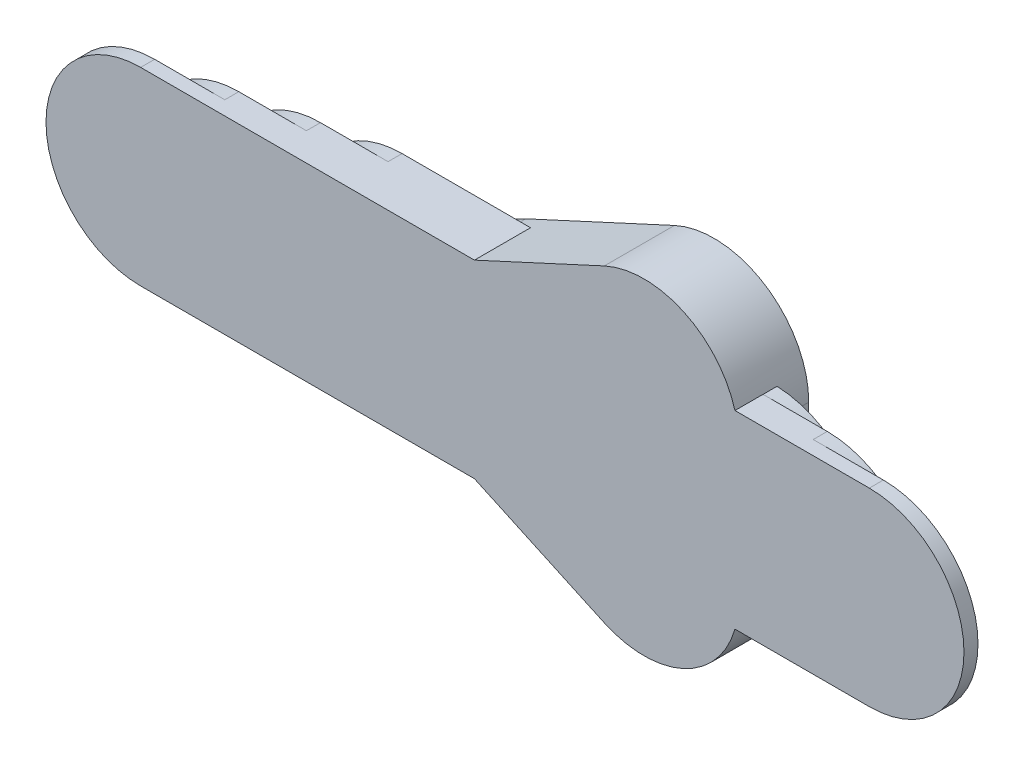
ISO-10303-21;
HEADER;
FILE_DESCRIPTION(('STEP AP214'),'2;1');
FILE_NAME('part.step','',(''),(''),'','','');
FILE_SCHEMA(('AUTOMOTIVE_DESIGN { 1 0 10303 214 1 1 1 1 }'));
ENDSEC;
DATA;
#1=APPLICATION_CONTEXT('core data for automotive mechanical design processes');
#2=APPLICATION_PROTOCOL_DEFINITION('international standard','automotive_design',2000,#1);
#3=PRODUCT_CONTEXT('',#1,'mechanical');
#4=PRODUCT('Part','Part','',(#3));
#5=PRODUCT_RELATED_PRODUCT_CATEGORY('part','',(#4));
#6=PRODUCT_DEFINITION_FORMATION('','',#4);
#7=PRODUCT_DEFINITION_CONTEXT('part definition',#1,'design');
#8=PRODUCT_DEFINITION('design','',#6,#7);
#9=PRODUCT_DEFINITION_SHAPE('','',#8);
#10=(LENGTH_UNIT() NAMED_UNIT(*) SI_UNIT(.MILLI.,.METRE.));
#11=(NAMED_UNIT(*) PLANE_ANGLE_UNIT() SI_UNIT($,.RADIAN.));
#12=(NAMED_UNIT(*) SI_UNIT($,.STERADIAN.) SOLID_ANGLE_UNIT());
#13=UNCERTAINTY_MEASURE_WITH_UNIT(LENGTH_MEASURE(1.E-05),#10,'distance_accuracy_value','');
#14=(GEOMETRIC_REPRESENTATION_CONTEXT(3) GLOBAL_UNCERTAINTY_ASSIGNED_CONTEXT((#13)) GLOBAL_UNIT_ASSIGNED_CONTEXT((#10,
#11,#12)) REPRESENTATION_CONTEXT('',''));
#15=CARTESIAN_POINT('',(0.,0.,0.));
#16=DIRECTION('',(0.,0.,1.));
#17=DIRECTION('',(1.,0.,0.));
#18=AXIS2_PLACEMENT_3D('',#15,#16,#17);
#19=CARTESIAN_POINT('',(-1.94999999999999,0.,-2.8));
#20=DIRECTION('',(0.,0.,1.));
#21=DIRECTION('',(1.,0.,0.));
#22=AXIS2_PLACEMENT_3D('',#19,#20,#21);
#23=CYLINDRICAL_SURFACE('',#22,18.9);
#24=CARTESIAN_POINT('',(-1.94999999999999,0.,0.));
#25=DIRECTION('',(0.,0.,-1.));
#26=DIRECTION('',(-1.,0.,0.));
#27=AXIS2_PLACEMENT_3D('',#24,#25,#26);
#28=CIRCLE('',#27,18.9);
#29=CARTESIAN_POINT('',(-9.86653496346351,-17.1621232419611,0.));
#30=VERTEX_POINT('',#29);
#31=CARTESIAN_POINT('',(-18.0097633136095,-9.96463759054204,0.));
#32=VERTEX_POINT('',#31);
#33=EDGE_CURVE('E232',#30,#32,#28,.T.);
#34=ORIENTED_EDGE('',*,*,#33,.T.);
#35=DIRECTION('',(0.,0.,-1.));
#36=VECTOR('',#35,1.);
#37=CARTESIAN_POINT('',(-18.0097633136095,-9.96463759054204,22.7488622004919));
#38=LINE('',#37,#36);
#39=CARTESIAN_POINT('',(-18.0097633136095,-9.96463759054204,-2.8));
#40=VERTEX_POINT('',#39);
#41=EDGE_CURVE('E221',#32,#40,#38,.T.);
#42=ORIENTED_EDGE('',*,*,#41,.T.);
#43=CARTESIAN_POINT('',(-1.94999999999999,0.,-2.8));
#44=DIRECTION('',(0.,0.,-1.));
#45=DIRECTION('',(-1.,0.,0.));
#46=AXIS2_PLACEMENT_3D('',#43,#44,#45);
#47=CIRCLE('',#46,18.9);
#48=CARTESIAN_POINT('',(-9.86653496346351,-17.1621232419611,-2.8));
#49=VERTEX_POINT('',#48);
#50=EDGE_CURVE('E231',#49,#40,#47,.T.);
#51=ORIENTED_EDGE('',*,*,#50,.F.);
#52=DIRECTION('',(0.,0.,1.));
#53=VECTOR('',#52,1.);
#54=CARTESIAN_POINT('',(-9.86653496346351,-17.1621232419611,-2.8));
#55=LINE('',#54,#53);
#56=EDGE_CURVE('E254',#49,#30,#55,.T.);
#57=ORIENTED_EDGE('',*,*,#56,.T.);
#58=EDGE_LOOP('',(#34,#42,#51,#57));
#59=FACE_BOUND('',#58,.T.);
#60=ADVANCED_FACE('F33',(#59),#23,.T.);
#61=CARTESIAN_POINT('',(31.75,0.,2.8));
#62=DIRECTION('',(0.,0.,-1.));
#63=DIRECTION('',(-1.,0.,0.));
#64=AXIS2_PLACEMENT_3D('',#61,#62,#63);
#65=CYLINDRICAL_SURFACE('',#64,18.9);
#66=DIRECTION('',(0.,0.,-1.));
#67=VECTOR('',#66,1.);
#68=CARTESIAN_POINT('',(46.65,11.6275534829989,67.9653304542279));
#69=LINE('',#68,#67);
#70=CARTESIAN_POINT('',(46.65,11.6275534829989,2.8));
#71=VERTEX_POINT('',#70);
#72=CARTESIAN_POINT('',(46.65,11.6275534829989,0.));
#73=VERTEX_POINT('',#72);
#74=EDGE_CURVE('E474',#71,#73,#69,.T.);
#75=ORIENTED_EDGE('',*,*,#74,.F.);
#76=CARTESIAN_POINT('',(31.75,0.,2.8));
#77=DIRECTION('',(0.,0.,1.));
#78=DIRECTION('',(-1.,0.,0.));
#79=AXIS2_PLACEMENT_3D('',#76,#77,#78);
#80=CIRCLE('',#79,18.9);
#81=CARTESIAN_POINT('',(46.65,-11.6275534829989,2.8));
#82=VERTEX_POINT('',#81);
#83=EDGE_CURVE('E273',#82,#71,#80,.T.);
#84=ORIENTED_EDGE('',*,*,#83,.F.);
#85=DIRECTION('',(0.,0.,-1.));
#86=VECTOR('',#85,1.);
#87=CARTESIAN_POINT('',(46.65,-11.6275534829989,67.9653304542279));
#88=LINE('',#87,#86);
#89=CARTESIAN_POINT('',(46.65,-11.6275534829989,0.));
#90=VERTEX_POINT('',#89);
#91=EDGE_CURVE('E313',#82,#90,#88,.T.);
#92=ORIENTED_EDGE('',*,*,#91,.T.);
#93=CARTESIAN_POINT('',(31.75,0.,0.));
#94=DIRECTION('',(0.,0.,1.));
#95=DIRECTION('',(-1.,0.,0.));
#96=AXIS2_PLACEMENT_3D('',#93,#94,#95);
#97=CIRCLE('',#96,18.9);
#98=EDGE_CURVE('E272',#90,#73,#97,.T.);
#99=ORIENTED_EDGE('',*,*,#98,.T.);
#100=EDGE_LOOP('',(#75,#84,#92,#99));
#101=FACE_BOUND('',#100,.T.);
#102=ADVANCED_FACE('F35',(#101),#65,.T.);
#103=CARTESIAN_POINT('',(45.25,0.,2.8));
#104=DIRECTION('',(0.,0.,-1.));
#105=DIRECTION('',(-1.,0.,0.));
#106=AXIS2_PLACEMENT_3D('',#103,#104,#105);
#107=PLANE('',#106);
#108=DIRECTION('',(0.,1.,0.));
#109=VECTOR('',#108,1.);
#110=CARTESIAN_POINT('',(46.6500000000002,0.,2.8));
#111=LINE('',#110,#109);
#112=CARTESIAN_POINT('',(46.65,13.7,2.8));
#113=VERTEX_POINT('',#112);
#114=EDGE_CURVE('E536',#71,#113,#111,.T.);
#115=ORIENTED_EDGE('',*,*,#114,.T.);
#116=CARTESIAN_POINT('',(27.75,13.7,2.8));
#117=DIRECTION('',(0.,0.,-1.));
#118=DIRECTION('',(-1.,0.,0.));
#119=AXIS2_PLACEMENT_3D('',#116,#117,#118);
#120=CIRCLE('',#119,18.9);
#121=CARTESIAN_POINT('',(45.9240168223525,18.8879776927861,2.8));
#122=VERTEX_POINT('',#121);
#123=EDGE_CURVE('E422',#113,#122,#120,.F.);
#124=ORIENTED_EDGE('',*,*,#123,.T.);
#125=CARTESIAN_POINT('',(45.25,0.,2.8));
#126=DIRECTION('',(0.,0.,1.));
#127=DIRECTION('',(-1.,0.,0.));
#128=AXIS2_PLACEMENT_3D('',#125,#126,#127);
#129=CIRCLE('',#128,18.9);
#130=CARTESIAN_POINT('',(45.9240168223526,-18.8879776927861,2.8));
#131=VERTEX_POINT('',#130);
#132=EDGE_CURVE('E386',#131,#122,#129,.T.);
#133=ORIENTED_EDGE('',*,*,#132,.F.);
#134=CARTESIAN_POINT('',(27.75,-13.7,2.8));
#135=DIRECTION('',(0.,0.,-1.));
#136=DIRECTION('',(-1.,0.,0.));
#137=AXIS2_PLACEMENT_3D('',#134,#135,#136);
#138=CIRCLE('',#137,18.9);
#139=CARTESIAN_POINT('',(46.65,-13.7,2.8));
#140=VERTEX_POINT('',#139);
#141=EDGE_CURVE('E486',#131,#140,#138,.F.);
#142=ORIENTED_EDGE('',*,*,#141,.T.);
#143=DIRECTION('',(0.,1.,0.));
#144=VECTOR('',#143,1.);
#145=CARTESIAN_POINT('',(46.6500000000001,0.,2.8));
#146=LINE('',#145,#144);
#147=EDGE_CURVE('E337',#140,#82,#146,.T.);
#148=ORIENTED_EDGE('',*,*,#147,.T.);
#149=ORIENTED_EDGE('',*,*,#83,.T.);
#150=EDGE_LOOP('',(#115,#124,#133,#142,#148,#149));
#151=FACE_BOUND('',#150,.T.);
#152=ADVANCED_FACE('F449',(#151),#107,.T.);
#153=CARTESIAN_POINT('',(45.25,0.,5.6));
#154=DIRECTION('',(0.,0.,-1.));
#155=DIRECTION('',(-1.,0.,0.));
#156=AXIS2_PLACEMENT_3D('',#153,#154,#155);
#157=CYLINDRICAL_SURFACE('',#156,18.9);
#158=DIRECTION('',(0.,0.,-1.));
#159=VECTOR('',#158,1.);
#160=CARTESIAN_POINT('',(45.9240168223525,18.8879776927861,5.6));
#161=LINE('',#160,#159);
#162=CARTESIAN_POINT('',(45.9240168223525,18.8879776927861,5.6));
#163=VERTEX_POINT('',#162);
#164=EDGE_CURVE('E476',#163,#122,#161,.T.);
#165=ORIENTED_EDGE('',*,*,#164,.F.);
#166=CARTESIAN_POINT('',(45.25,0.,5.6));
#167=DIRECTION('',(0.,0.,1.));
#168=DIRECTION('',(-1.,0.,0.));
#169=AXIS2_PLACEMENT_3D('',#166,#167,#168);
#170=CIRCLE('',#169,18.9);
#171=CARTESIAN_POINT('',(45.9240168223526,-18.8879776927861,5.6));
#172=VERTEX_POINT('',#171);
#173=EDGE_CURVE('E387',#172,#163,#170,.T.);
#174=ORIENTED_EDGE('',*,*,#173,.F.);
#175=DIRECTION('',(0.,0.,-1.));
#176=VECTOR('',#175,1.);
#177=CARTESIAN_POINT('',(45.9240168223526,-18.8879776927861,4.2));
#178=LINE('',#177,#176);
#179=EDGE_CURVE('E484',#131,#172,#178,.F.);
#180=ORIENTED_EDGE('',*,*,#179,.F.);
#181=ORIENTED_EDGE('',*,*,#132,.T.);
#182=EDGE_LOOP('',(#165,#174,#180,#181));
#183=FACE_BOUND('',#182,.T.);
#184=ADVANCED_FACE('F529',(#183),#157,.T.);
#185=CARTESIAN_POINT('',(-31.75,18.9,2.8));
#186=DIRECTION('',(0.,-1.,0.));
#187=DIRECTION('',(0.,0.,-1.));
#188=AXIS2_PLACEMENT_3D('',#185,#186,#187);
#189=PLANE('',#188);
#190=DIRECTION('',(0.,0.,-1.));
#191=VECTOR('',#190,1.);
#192=CARTESIAN_POINT('',(-6.09902111574405,18.9,67.9653304542279));
#193=LINE('',#192,#191);
#194=CARTESIAN_POINT('',(-6.09902111574405,18.9,11.2));
#195=VERTEX_POINT('',#194);
#196=CARTESIAN_POINT('',(-6.09902111574405,18.9,0.));
#197=VERTEX_POINT('',#196);
#198=EDGE_CURVE('E58',#195,#197,#193,.T.);
#199=ORIENTED_EDGE('',*,*,#198,.T.);
#200=DIRECTION('',(-1.,0.,0.));
#201=VECTOR('',#200,1.);
#202=CARTESIAN_POINT('',(-31.75,18.9,0.));
#203=LINE('',#202,#201);
#204=CARTESIAN_POINT('',(-31.75,18.9,0.));
#205=VERTEX_POINT('',#204);
#206=EDGE_CURVE('E283',#197,#205,#203,.T.);
#207=ORIENTED_EDGE('',*,*,#206,.T.);
#208=DIRECTION('',(0.,0.,-1.));
#209=VECTOR('',#208,1.);
#210=CARTESIAN_POINT('',(-31.75,18.9,2.8));
#211=LINE('',#210,#209);
#212=CARTESIAN_POINT('',(-31.75,18.9,2.8));
#213=VERTEX_POINT('',#212);
#214=EDGE_CURVE('E37',#213,#205,#211,.T.);
#215=ORIENTED_EDGE('',*,*,#214,.F.);
#216=DIRECTION('',(-1.,0.,0.));
#217=VECTOR('',#216,1.);
#218=CARTESIAN_POINT('',(-45.25,18.9,2.8));
#219=LINE('',#218,#217);
#220=CARTESIAN_POINT('',(-45.25,18.9,2.8));
#221=VERTEX_POINT('',#220);
#222=EDGE_CURVE('E397',#213,#221,#219,.T.);
#223=ORIENTED_EDGE('',*,*,#222,.T.);
#224=DIRECTION('',(0.,0.,-1.));
#225=VECTOR('',#224,1.);
#226=CARTESIAN_POINT('',(-45.25,18.9,5.6));
#227=LINE('',#226,#225);
#228=CARTESIAN_POINT('',(-45.25,18.9,5.6));
#229=VERTEX_POINT('',#228);
#230=EDGE_CURVE('E245',#229,#221,#227,.T.);
#231=ORIENTED_EDGE('',*,*,#230,.F.);
#232=DIRECTION('',(-1.,0.,0.));
#233=VECTOR('',#232,1.);
#234=CARTESIAN_POINT('',(-58.75,18.9,5.6));
#235=LINE('',#234,#233);
#236=CARTESIAN_POINT('',(-58.75,18.9,5.6));
#237=VERTEX_POINT('',#236);
#238=EDGE_CURVE('E366',#229,#237,#235,.T.);
#239=ORIENTED_EDGE('',*,*,#238,.T.);
#240=DIRECTION('',(0.,0.,-1.));
#241=VECTOR('',#240,1.);
#242=CARTESIAN_POINT('',(-58.75,18.9,8.4));
#243=LINE('',#242,#241);
#244=CARTESIAN_POINT('',(-58.75,18.9,8.4));
#245=VERTEX_POINT('',#244);
#246=EDGE_CURVE('E380',#245,#237,#243,.T.);
#247=ORIENTED_EDGE('',*,*,#246,.F.);
#248=DIRECTION('',(-1.,0.,0.));
#249=VECTOR('',#248,1.);
#250=CARTESIAN_POINT('',(-72.7500000000001,18.9,8.4));
#251=LINE('',#250,#249);
#252=CARTESIAN_POINT('',(-72.7500000000001,18.9,8.4));
#253=VERTEX_POINT('',#252);
#254=EDGE_CURVE('E336',#245,#253,#251,.T.);
#255=ORIENTED_EDGE('',*,*,#254,.T.);
#256=DIRECTION('',(0.,0.,-1.));
#257=VECTOR('',#256,1.);
#258=CARTESIAN_POINT('',(-72.7500000000001,18.9,11.2));
#259=LINE('',#258,#257);
#260=CARTESIAN_POINT('',(-72.7500000000001,18.9,11.2));
#261=VERTEX_POINT('',#260);
#262=EDGE_CURVE('E349',#261,#253,#259,.T.);
#263=ORIENTED_EDGE('',*,*,#262,.F.);
#264=DIRECTION('',(-1.,0.,0.));
#265=VECTOR('',#264,1.);
#266=CARTESIAN_POINT('',(-72.7500000000001,18.9,11.2));
#267=LINE('',#266,#265);
#268=EDGE_CURVE('E492',#195,#261,#267,.T.);
#269=ORIENTED_EDGE('',*,*,#268,.F.);
#270=EDGE_LOOP('',(#199,#207,#215,#223,#231,#239,#247,#255,#263,#269));
#271=FACE_BOUND('',#270,.T.);
#272=ADVANCED_FACE('F498',(#271),#189,.F.);
#273=DIRECTION('',(0.,0.,-1.));
#274=VECTOR('',#273,1.);
#275=CARTESIAN_POINT('',(45.920580618131,18.9,67.9653304542279));
#276=LINE('',#275,#274);
#277=CARTESIAN_POINT('',(45.920580618131,18.9,11.2));
#278=VERTEX_POINT('',#277);
#279=CARTESIAN_POINT('',(45.920580618131,18.9,5.6));
#280=VERTEX_POINT('',#279);
#281=EDGE_CURVE('E542',#278,#280,#276,.T.);
#282=ORIENTED_EDGE('',*,*,#281,.F.);
#283=CARTESIAN_POINT('',(72.7499999999999,18.9,11.2));
#284=VERTEX_POINT('',#283);
#285=EDGE_CURVE('E493',#284,#278,#267,.T.);
#286=ORIENTED_EDGE('',*,*,#285,.F.);
#287=DIRECTION('',(0.,0.,-1.));
#288=VECTOR('',#287,1.);
#289=CARTESIAN_POINT('',(72.7499999999999,18.9,11.2));
#290=LINE('',#289,#288);
#291=CARTESIAN_POINT('',(72.7499999999999,18.9,8.4));
#292=VERTEX_POINT('',#291);
#293=EDGE_CURVE('E352',#284,#292,#290,.T.);
#294=ORIENTED_EDGE('',*,*,#293,.T.);
#295=CARTESIAN_POINT('',(58.75,18.9,8.4));
#296=VERTEX_POINT('',#295);
#297=EDGE_CURVE('E338',#292,#296,#251,.T.);
#298=ORIENTED_EDGE('',*,*,#297,.T.);
#299=DIRECTION('',(0.,0.,-1.));
#300=VECTOR('',#299,1.);
#301=CARTESIAN_POINT('',(58.75,18.9,8.4));
#302=LINE('',#301,#300);
#303=CARTESIAN_POINT('',(58.75,18.9,5.6));
#304=VERTEX_POINT('',#303);
#305=EDGE_CURVE('E383',#296,#304,#302,.T.);
#306=ORIENTED_EDGE('',*,*,#305,.T.);
#307=EDGE_CURVE('E367',#304,#280,#235,.T.);
#308=ORIENTED_EDGE('',*,*,#307,.T.);
#309=EDGE_LOOP('',(#282,#286,#294,#298,#306,#308));
#310=FACE_BOUND('',#309,.T.);
#311=ADVANCED_FACE('F565',(#310),#189,.F.);
#312=CARTESIAN_POINT('',(-31.75,-18.9,2.8));
#313=DIRECTION('',(0.,1.,0.));
#314=DIRECTION('',(0.,0.,1.));
#315=AXIS2_PLACEMENT_3D('',#312,#313,#314);
#316=PLANE('',#315);
#317=DIRECTION('',(0.,0.,-1.));
#318=VECTOR('',#317,1.);
#319=CARTESIAN_POINT('',(45.9205806181311,-18.9,67.9653304542279));
#320=LINE('',#319,#318);
#321=CARTESIAN_POINT('',(45.9205806181311,-18.9,5.6));
#322=VERTEX_POINT('',#321);
#323=CARTESIAN_POINT('',(45.9205806181311,-18.9,11.2));
#324=VERTEX_POINT('',#323);
#325=EDGE_CURVE('E488',#322,#324,#320,.F.);
#326=ORIENTED_EDGE('',*,*,#325,.F.);
#327=DIRECTION('',(1.,0.,0.));
#328=VECTOR('',#327,1.);
#329=CARTESIAN_POINT('',(-58.75,-18.9,5.6));
#330=LINE('',#329,#328);
#331=CARTESIAN_POINT('',(58.75,-18.9,5.6));
#332=VERTEX_POINT('',#331);
#333=EDGE_CURVE('E372',#322,#332,#330,.T.);
#334=ORIENTED_EDGE('',*,*,#333,.T.);
#335=DIRECTION('',(0.,0.,-1.));
#336=VECTOR('',#335,1.);
#337=CARTESIAN_POINT('',(58.75,-18.9,8.4));
#338=LINE('',#337,#336);
#339=CARTESIAN_POINT('',(58.75,-18.9,8.4));
#340=VERTEX_POINT('',#339);
#341=EDGE_CURVE('E363',#340,#332,#338,.T.);
#342=ORIENTED_EDGE('',*,*,#341,.F.);
#343=DIRECTION('',(1.,0.,0.));
#344=VECTOR('',#343,1.);
#345=CARTESIAN_POINT('',(-72.7500000000001,-18.9,8.4));
#346=LINE('',#345,#344);
#347=CARTESIAN_POINT('',(72.7499999999999,-18.9,8.4));
#348=VERTEX_POINT('',#347);
#349=EDGE_CURVE('E343',#340,#348,#346,.T.);
#350=ORIENTED_EDGE('',*,*,#349,.T.);
#351=DIRECTION('',(0.,0.,-1.));
#352=VECTOR('',#351,1.);
#353=CARTESIAN_POINT('',(72.7499999999999,-18.9,11.2));
#354=LINE('',#353,#352);
#355=CARTESIAN_POINT('',(72.7499999999999,-18.9,11.2));
#356=VERTEX_POINT('',#355);
#357=EDGE_CURVE('E324',#356,#348,#354,.T.);
#358=ORIENTED_EDGE('',*,*,#357,.F.);
#359=DIRECTION('',(1.,0.,0.));
#360=VECTOR('',#359,1.);
#361=CARTESIAN_POINT('',(-72.7500000000001,-18.9,11.2));
#362=LINE('',#361,#360);
#363=EDGE_CURVE('E325',#324,#356,#362,.T.);
#364=ORIENTED_EDGE('',*,*,#363,.F.);
#365=EDGE_LOOP('',(#326,#334,#342,#350,#358,#364));
#366=FACE_BOUND('',#365,.T.);
#367=ADVANCED_FACE('F469',(#366),#316,.F.);
#368=DIRECTION('',(0.,0.,-1.));
#369=VECTOR('',#368,1.);
#370=CARTESIAN_POINT('',(-6.09902111574404,-18.9,67.9653304542279));
#371=LINE('',#370,#369);
#372=CARTESIAN_POINT('',(-6.09902111574404,-18.9,11.2));
#373=VERTEX_POINT('',#372);
#374=CARTESIAN_POINT('',(-6.09902111574404,-18.9,0.));
#375=VERTEX_POINT('',#374);
#376=EDGE_CURVE('E307',#373,#375,#371,.T.);
#377=ORIENTED_EDGE('',*,*,#376,.F.);
#378=CARTESIAN_POINT('',(-72.7500000000001,-18.9,11.2));
#379=VERTEX_POINT('',#378);
#380=EDGE_CURVE('E310',#379,#373,#362,.T.);
#381=ORIENTED_EDGE('',*,*,#380,.F.);
#382=DIRECTION('',(0.,0.,-1.));
#383=VECTOR('',#382,1.);
#384=CARTESIAN_POINT('',(-72.7500000000001,-18.9,11.2));
#385=LINE('',#384,#383);
#386=CARTESIAN_POINT('',(-72.7500000000001,-18.9,8.4));
#387=VERTEX_POINT('',#386);
#388=EDGE_CURVE('E328',#379,#387,#385,.T.);
#389=ORIENTED_EDGE('',*,*,#388,.T.);
#390=CARTESIAN_POINT('',(-58.75,-18.9,8.4));
#391=VERTEX_POINT('',#390);
#392=EDGE_CURVE('E344',#387,#391,#346,.T.);
#393=ORIENTED_EDGE('',*,*,#392,.T.);
#394=DIRECTION('',(0.,0.,-1.));
#395=VECTOR('',#394,1.);
#396=CARTESIAN_POINT('',(-58.75,-18.9,8.4));
#397=LINE('',#396,#395);
#398=CARTESIAN_POINT('',(-58.75,-18.9,5.6));
#399=VERTEX_POINT('',#398);
#400=EDGE_CURVE('E377',#391,#399,#397,.T.);
#401=ORIENTED_EDGE('',*,*,#400,.T.);
#402=CARTESIAN_POINT('',(-45.25,-18.9,5.6));
#403=VERTEX_POINT('',#402);
#404=EDGE_CURVE('E360',#399,#403,#330,.T.);
#405=ORIENTED_EDGE('',*,*,#404,.T.);
#406=DIRECTION('',(0.,0.,-1.));
#407=VECTOR('',#406,1.);
#408=CARTESIAN_POINT('',(-45.25,-18.9,5.6));
#409=LINE('',#408,#407);
#410=CARTESIAN_POINT('',(-45.25,-18.9,2.8));
#411=VERTEX_POINT('',#410);
#412=EDGE_CURVE('E394',#403,#411,#409,.T.);
#413=ORIENTED_EDGE('',*,*,#412,.T.);
#414=DIRECTION('',(1.,0.,0.));
#415=VECTOR('',#414,1.);
#416=CARTESIAN_POINT('',(-45.25,-18.9,2.8));
#417=LINE('',#416,#415);
#418=CARTESIAN_POINT('',(-31.75,-18.9,2.8));
#419=VERTEX_POINT('',#418);
#420=EDGE_CURVE('E391',#411,#419,#417,.T.);
#421=ORIENTED_EDGE('',*,*,#420,.T.);
#422=DIRECTION('',(0.,0.,-1.));
#423=VECTOR('',#422,1.);
#424=CARTESIAN_POINT('',(-31.75,-18.9,2.8));
#425=LINE('',#424,#423);
#426=CARTESIAN_POINT('',(-31.75,-18.9,0.));
#427=VERTEX_POINT('',#426);
#428=EDGE_CURVE('E280',#419,#427,#425,.T.);
#429=ORIENTED_EDGE('',*,*,#428,.T.);
#430=DIRECTION('',(1.,0.,0.));
#431=VECTOR('',#430,1.);
#432=CARTESIAN_POINT('',(-31.75,-18.9,0.));
#433=LINE('',#432,#431);
#434=EDGE_CURVE('E277',#427,#375,#433,.T.);
#435=ORIENTED_EDGE('',*,*,#434,.T.);
#436=EDGE_LOOP('',(#377,#381,#389,#393,#401,#405,#413,#421,#429,#435));
#437=FACE_BOUND('',#436,.T.);
#438=ADVANCED_FACE('F305',(#437),#316,.F.);
#439=CARTESIAN_POINT('',(31.75,0.,0.));
#440=DIRECTION('',(0.,0.,-1.));
#441=DIRECTION('',(-1.,0.,0.));
#442=AXIS2_PLACEMENT_3D('',#439,#440,#441);
#443=PLANE('',#442);
#444=DIRECTION('',(0.,-1.,0.));
#445=VECTOR('',#444,1.);
#446=CARTESIAN_POINT('',(46.65,-13.7,0.));
#447=LINE('',#446,#445);
#448=EDGE_CURVE('E11',#73,#90,#447,.T.);
#449=ORIENTED_EDGE('',*,*,#448,.F.);
#450=ORIENTED_EDGE('',*,*,#98,.F.);
#451=EDGE_LOOP('',(#449,#450));
#452=FACE_BOUND('',#451,.T.);
#453=ADVANCED_FACE('F458',(#452),#443,.T.);
#454=CARTESIAN_POINT('',(-31.75,0.,2.8));
#455=DIRECTION('',(0.,0.,-1.));
#456=DIRECTION('',(-1.,0.,0.));
#457=AXIS2_PLACEMENT_3D('',#454,#455,#456);
#458=CYLINDRICAL_SURFACE('',#457,18.9);
#459=CARTESIAN_POINT('',(-31.75,0.,0.));
#460=DIRECTION('',(0.,0.,1.));
#461=DIRECTION('',(1.,0.,0.));
#462=AXIS2_PLACEMENT_3D('',#459,#460,#461);
#463=CIRCLE('',#462,18.9);
#464=EDGE_CURVE('E285',#205,#427,#463,.T.);
#465=ORIENTED_EDGE('',*,*,#464,.T.);
#466=ORIENTED_EDGE('',*,*,#428,.F.);
#467=CARTESIAN_POINT('',(-31.75,0.,2.8));
#468=DIRECTION('',(0.,0.,1.));
#469=DIRECTION('',(1.,0.,0.));
#470=AXIS2_PLACEMENT_3D('',#467,#468,#469);
#471=CIRCLE('',#470,18.9);
#472=EDGE_CURVE('E276',#213,#419,#471,.T.);
#473=ORIENTED_EDGE('',*,*,#472,.F.);
#474=ORIENTED_EDGE('',*,*,#214,.T.);
#475=EDGE_LOOP('',(#465,#466,#473,#474));
#476=FACE_BOUND('',#475,.T.);
#477=ADVANCED_FACE('F296',(#476),#458,.T.);
#478=CARTESIAN_POINT('',(-18.85,0.,0.));
#479=DIRECTION('',(0.,0.,-1.));
#480=DIRECTION('',(-1.,0.,0.));
#481=AXIS2_PLACEMENT_3D('',#478,#479,#480);
#482=CIRCLE('',#481,10.);
#483=CARTESIAN_POINT('',(-18.0097633136095,9.96463759054204,0.));
#484=VERTEX_POINT('',#483);
#485=EDGE_CURVE('E568',#484,#32,#482,.F.);
#486=ORIENTED_EDGE('',*,*,#485,.T.);
#487=ORIENTED_EDGE('',*,*,#33,.F.);
#488=DIRECTION('',(-0.908048848781008,0.418864283781138,0.));
#489=VECTOR('',#488,1.);
#490=CARTESIAN_POINT('',(19.8334650365365,-30.8621232419611,0.));
#491=LINE('',#490,#489);
#492=EDGE_CURVE('E42',#375,#30,#491,.T.);
#493=ORIENTED_EDGE('',*,*,#492,.F.);
#494=ORIENTED_EDGE('',*,*,#434,.F.);
#495=ORIENTED_EDGE('',*,*,#464,.F.);
#496=ORIENTED_EDGE('',*,*,#206,.F.);
#497=DIRECTION('',(0.908048848781008,0.418864283781138,0.));
#498=VECTOR('',#497,1.);
#499=CARTESIAN_POINT('',(19.8334650365365,30.862123241961,0.));
#500=LINE('',#499,#498);
#501=CARTESIAN_POINT('',(-9.8665349634635,17.162123241961,0.));
#502=VERTEX_POINT('',#501);
#503=EDGE_CURVE('E243',#502,#197,#500,.T.);
#504=ORIENTED_EDGE('',*,*,#503,.F.);
#505=EDGE_CURVE('E256',#484,#502,#28,.T.);
#506=ORIENTED_EDGE('',*,*,#505,.F.);
#507=EDGE_LOOP('',(#486,#487,#493,#494,#495,#496,#504,#506));
#508=FACE_BOUND('',#507,.T.);
#509=ADVANCED_FACE('F301',(#508),#443,.T.);
#510=CARTESIAN_POINT('',(-18.0097633136094,9.96463759054204,-2.8));
#511=VERTEX_POINT('',#510);
#512=CARTESIAN_POINT('',(-9.8665349634635,17.162123241961,-2.8));
#513=VERTEX_POINT('',#512);
#514=EDGE_CURVE('E239',#511,#513,#47,.T.);
#515=ORIENTED_EDGE('',*,*,#514,.F.);
#516=DIRECTION('',(0.,0.,-1.));
#517=VECTOR('',#516,1.);
#518=CARTESIAN_POINT('',(-18.0097633136095,9.96463759054204,22.7488622004919));
#519=LINE('',#518,#517);
#520=EDGE_CURVE('E224',#484,#511,#519,.T.);
#521=ORIENTED_EDGE('',*,*,#520,.F.);
#522=ORIENTED_EDGE('',*,*,#505,.T.);
#523=DIRECTION('',(0.,0.,1.));
#524=VECTOR('',#523,1.);
#525=CARTESIAN_POINT('',(-9.8665349634635,17.162123241961,-2.8));
#526=LINE('',#525,#524);
#527=EDGE_CURVE('E269',#513,#502,#526,.T.);
#528=ORIENTED_EDGE('',*,*,#527,.F.);
#529=EDGE_LOOP('',(#515,#521,#522,#528));
#530=FACE_BOUND('',#529,.T.);
#531=ADVANCED_FACE('F410',(#530),#23,.T.);
#532=CARTESIAN_POINT('',(19.8334650365365,30.862123241961,-2.8));
#533=DIRECTION('',(0.418864283781138,-0.908048848781008,0.));
#534=DIRECTION('',(0.908048848781008,0.418864283781138,0.));
#535=AXIS2_PLACEMENT_3D('',#532,#533,#534);
#536=PLANE('',#535);
#537=ORIENTED_EDGE('',*,*,#503,.T.);
#538=ORIENTED_EDGE('',*,*,#198,.F.);
#539=DIRECTION('',(0.908048848781008,0.418864283781138,0.));
#540=VECTOR('',#539,1.);
#541=CARTESIAN_POINT('',(19.8334650365365,30.862123241961,11.2));
#542=LINE('',#541,#540);
#543=CARTESIAN_POINT('',(19.8334650365365,30.862123241961,11.2));
#544=VERTEX_POINT('',#543);
#545=EDGE_CURVE('E497',#195,#544,#542,.T.);
#546=ORIENTED_EDGE('',*,*,#545,.T.);
#547=DIRECTION('',(0.,0.,1.));
#548=VECTOR('',#547,1.);
#549=CARTESIAN_POINT('',(19.8334650365365,30.862123241961,-2.8));
#550=LINE('',#549,#548);
#551=CARTESIAN_POINT('',(19.8334650365365,30.862123241961,-2.8));
#552=VERTEX_POINT('',#551);
#553=EDGE_CURVE('E267',#552,#544,#550,.T.);
#554=ORIENTED_EDGE('',*,*,#553,.F.);
#555=DIRECTION('',(0.908048848781008,0.418864283781138,0.));
#556=VECTOR('',#555,1.);
#557=CARTESIAN_POINT('',(19.8334650365365,30.862123241961,-2.8));
#558=LINE('',#557,#556);
#559=EDGE_CURVE('E238',#513,#552,#558,.T.);
#560=ORIENTED_EDGE('',*,*,#559,.F.);
#561=ORIENTED_EDGE('',*,*,#527,.T.);
#562=EDGE_LOOP('',(#537,#538,#546,#554,#560,#561));
#563=FACE_BOUND('',#562,.T.);
#564=ADVANCED_FACE('F412',(#563),#536,.F.);
#565=CARTESIAN_POINT('',(27.75,13.7,-2.8));
#566=DIRECTION('',(0.,0.,1.));
#567=DIRECTION('',(1.,0.,0.));
#568=AXIS2_PLACEMENT_3D('',#565,#566,#567);
#569=CYLINDRICAL_SURFACE('',#568,18.9);
#570=ORIENTED_EDGE('',*,*,#553,.T.);
#571=CARTESIAN_POINT('',(27.75,13.7,11.2));
#572=DIRECTION('',(0.,0.,-1.));
#573=DIRECTION('',(-1.,0.,0.));
#574=AXIS2_PLACEMENT_3D('',#571,#572,#573);
#575=CIRCLE('',#574,18.9);
#576=EDGE_CURVE('E539',#544,#278,#575,.T.);
#577=ORIENTED_EDGE('',*,*,#576,.T.);
#578=ORIENTED_EDGE('',*,*,#281,.T.);
#579=CARTESIAN_POINT('',(27.75,13.7,5.6));
#580=DIRECTION('',(0.,0.,-1.));
#581=DIRECTION('',(-1.,0.,0.));
#582=AXIS2_PLACEMENT_3D('',#579,#580,#581);
#583=CIRCLE('',#582,18.9);
#584=EDGE_CURVE('E538',#163,#280,#583,.F.);
#585=ORIENTED_EDGE('',*,*,#584,.F.);
#586=ORIENTED_EDGE('',*,*,#164,.T.);
#587=ORIENTED_EDGE('',*,*,#123,.F.);
#588=DIRECTION('',(0.,0.,1.));
#589=VECTOR('',#588,1.);
#590=CARTESIAN_POINT('',(46.65,13.7,-2.8));
#591=LINE('',#590,#589);
#592=CARTESIAN_POINT('',(46.65,13.7,-2.8));
#593=VERTEX_POINT('',#592);
#594=EDGE_CURVE('E265',#593,#113,#591,.T.);
#595=ORIENTED_EDGE('',*,*,#594,.F.);
#596=CARTESIAN_POINT('',(27.75,13.7,-2.8));
#597=DIRECTION('',(0.,0.,-1.));
#598=DIRECTION('',(1.,0.,0.));
#599=AXIS2_PLACEMENT_3D('',#596,#597,#598);
#600=CIRCLE('',#599,18.9);
#601=EDGE_CURVE('E241',#552,#593,#600,.T.);
#602=ORIENTED_EDGE('',*,*,#601,.F.);
#603=EDGE_LOOP('',(#570,#577,#578,#585,#586,#587,#595,#602));
#604=FACE_BOUND('',#603,.T.);
#605=ADVANCED_FACE('F420',(#604),#569,.T.);
#606=CARTESIAN_POINT('',(46.65,-13.7,-2.8));
#607=DIRECTION('',(-1.,0.,0.));
#608=DIRECTION('',(0.,-1.,0.));
#609=AXIS2_PLACEMENT_3D('',#606,#607,#608);
#610=PLANE('',#609);
#611=ORIENTED_EDGE('',*,*,#594,.T.);
#612=ORIENTED_EDGE('',*,*,#114,.F.);
#613=ORIENTED_EDGE('',*,*,#74,.T.);
#614=ORIENTED_EDGE('',*,*,#448,.T.);
#615=ORIENTED_EDGE('',*,*,#91,.F.);
#616=ORIENTED_EDGE('',*,*,#147,.F.);
#617=DIRECTION('',(0.,0.,1.));
#618=VECTOR('',#617,1.);
#619=CARTESIAN_POINT('',(46.65,-13.7,-2.8));
#620=LINE('',#619,#618);
#621=CARTESIAN_POINT('',(46.65,-13.7,-2.8));
#622=VERTEX_POINT('',#621);
#623=EDGE_CURVE('E263',#622,#140,#620,.T.);
#624=ORIENTED_EDGE('',*,*,#623,.F.);
#625=DIRECTION('',(0.,-1.,0.));
#626=VECTOR('',#625,1.);
#627=CARTESIAN_POINT('',(46.65,-13.7,-2.8));
#628=LINE('',#627,#626);
#629=EDGE_CURVE('E249',#593,#622,#628,.T.);
#630=ORIENTED_EDGE('',*,*,#629,.F.);
#631=EDGE_LOOP('',(#611,#612,#613,#614,#615,#616,#624,#630));
#632=FACE_BOUND('',#631,.T.);
#633=ADVANCED_FACE('F425',(#632),#610,.F.);
#634=CARTESIAN_POINT('',(27.75,-13.7,-2.8));
#635=DIRECTION('',(0.,0.,1.));
#636=DIRECTION('',(1.,0.,0.));
#637=AXIS2_PLACEMENT_3D('',#634,#635,#636);
#638=CYLINDRICAL_SURFACE('',#637,18.9);
#639=ORIENTED_EDGE('',*,*,#623,.T.);
#640=ORIENTED_EDGE('',*,*,#141,.F.);
#641=ORIENTED_EDGE('',*,*,#179,.T.);
#642=CARTESIAN_POINT('',(27.75,-13.7,5.6));
#643=DIRECTION('',(0.,0.,-1.));
#644=DIRECTION('',(-1.,0.,0.));
#645=AXIS2_PLACEMENT_3D('',#642,#643,#644);
#646=CIRCLE('',#645,18.9);
#647=EDGE_CURVE('E481',#322,#172,#646,.F.);
#648=ORIENTED_EDGE('',*,*,#647,.F.);
#649=ORIENTED_EDGE('',*,*,#325,.T.);
#650=CARTESIAN_POINT('',(27.75,-13.7,11.2));
#651=DIRECTION('',(0.,0.,-1.));
#652=DIRECTION('',(-1.,0.,0.));
#653=AXIS2_PLACEMENT_3D('',#650,#651,#652);
#654=CIRCLE('',#653,18.9);
#655=CARTESIAN_POINT('',(19.8334650365365,-30.8621232419611,11.2));
#656=VERTEX_POINT('',#655);
#657=EDGE_CURVE('E312',#324,#656,#654,.T.);
#658=ORIENTED_EDGE('',*,*,#657,.T.);
#659=DIRECTION('',(0.,0.,1.));
#660=VECTOR('',#659,1.);
#661=CARTESIAN_POINT('',(19.8334650365365,-30.8621232419611,-2.8));
#662=LINE('',#661,#660);
#663=CARTESIAN_POINT('',(19.8334650365365,-30.8621232419611,-2.8));
#664=VERTEX_POINT('',#663);
#665=EDGE_CURVE('E261',#664,#656,#662,.T.);
#666=ORIENTED_EDGE('',*,*,#665,.F.);
#667=CARTESIAN_POINT('',(27.75,-13.7,-2.8));
#668=DIRECTION('',(0.,0.,-1.));
#669=DIRECTION('',(-1.,0.,0.));
#670=AXIS2_PLACEMENT_3D('',#667,#668,#669);
#671=CIRCLE('',#670,18.9);
#672=EDGE_CURVE('E251',#622,#664,#671,.T.);
#673=ORIENTED_EDGE('',*,*,#672,.F.);
#674=EDGE_LOOP('',(#639,#640,#641,#648,#649,#658,#666,#673));
#675=FACE_BOUND('',#674,.T.);
#676=ADVANCED_FACE('F432',(#675),#638,.T.);
#677=CARTESIAN_POINT('',(19.8334650365365,-30.8621232419611,-2.8));
#678=DIRECTION('',(0.418864283781138,0.908048848781008,0.));
#679=DIRECTION('',(-0.908048848781008,0.418864283781138,0.));
#680=AXIS2_PLACEMENT_3D('',#677,#678,#679);
#681=PLANE('',#680);
#682=ORIENTED_EDGE('',*,*,#665,.T.);
#683=DIRECTION('',(-0.908048848781008,0.418864283781139,0.));
#684=VECTOR('',#683,1.);
#685=CARTESIAN_POINT('',(-6.09902111574404,-18.9,11.2));
#686=LINE('',#685,#684);
#687=EDGE_CURVE('E320',#656,#373,#686,.T.);
#688=ORIENTED_EDGE('',*,*,#687,.T.);
#689=ORIENTED_EDGE('',*,*,#376,.T.);
#690=ORIENTED_EDGE('',*,*,#492,.T.);
#691=ORIENTED_EDGE('',*,*,#56,.F.);
#692=DIRECTION('',(-0.908048848781008,0.418864283781138,0.));
#693=VECTOR('',#692,1.);
#694=CARTESIAN_POINT('',(19.8334650365365,-30.8621232419611,-2.8));
#695=LINE('',#694,#693);
#696=EDGE_CURVE('E236',#664,#49,#695,.T.);
#697=ORIENTED_EDGE('',*,*,#696,.F.);
#698=EDGE_LOOP('',(#682,#688,#689,#690,#691,#697));
#699=FACE_BOUND('',#698,.T.);
#700=ADVANCED_FACE('F434',(#699),#681,.F.);
#701=CARTESIAN_POINT('',(-1.94999999999999,0.,-2.8));
#702=DIRECTION('',(0.,0.,-1.));
#703=DIRECTION('',(-1.,0.,0.));
#704=AXIS2_PLACEMENT_3D('',#701,#702,#703);
#705=PLANE('',#704);
#706=ORIENTED_EDGE('',*,*,#50,.T.);
#707=CARTESIAN_POINT('',(-18.85,0.,-2.8));
#708=DIRECTION('',(0.,0.,-1.));
#709=DIRECTION('',(-1.,0.,0.));
#710=AXIS2_PLACEMENT_3D('',#707,#708,#709);
#711=CIRCLE('',#710,10.);
#712=EDGE_CURVE('E50',#40,#511,#711,.T.);
#713=ORIENTED_EDGE('',*,*,#712,.T.);
#714=ORIENTED_EDGE('',*,*,#514,.T.);
#715=ORIENTED_EDGE('',*,*,#559,.T.);
#716=ORIENTED_EDGE('',*,*,#601,.T.);
#717=ORIENTED_EDGE('',*,*,#629,.T.);
#718=ORIENTED_EDGE('',*,*,#672,.T.);
#719=ORIENTED_EDGE('',*,*,#696,.T.);
#720=EDGE_LOOP('',(#706,#713,#714,#715,#716,#717,#718,#719));
#721=FACE_BOUND('',#720,.T.);
#722=ADVANCED_FACE('F234',(#721),#705,.T.);
#723=CARTESIAN_POINT('',(-45.25,0.,5.6));
#724=DIRECTION('',(0.,0.,-1.));
#725=DIRECTION('',(-1.,0.,0.));
#726=AXIS2_PLACEMENT_3D('',#723,#724,#725);
#727=CYLINDRICAL_SURFACE('',#726,18.9);
#728=CARTESIAN_POINT('',(-45.25,0.,2.8));
#729=DIRECTION('',(0.,0.,1.));
#730=DIRECTION('',(1.,0.,0.));
#731=AXIS2_PLACEMENT_3D('',#728,#729,#730);
#732=CIRCLE('',#731,18.9);
#733=EDGE_CURVE('E399',#221,#411,#732,.T.);
#734=ORIENTED_EDGE('',*,*,#733,.T.);
#735=ORIENTED_EDGE('',*,*,#412,.F.);
#736=CARTESIAN_POINT('',(-45.25,0.,5.6));
#737=DIRECTION('',(0.,0.,1.));
#738=DIRECTION('',(1.,0.,0.));
#739=AXIS2_PLACEMENT_3D('',#736,#737,#738);
#740=CIRCLE('',#739,18.9);
#741=EDGE_CURVE('E390',#229,#403,#740,.T.);
#742=ORIENTED_EDGE('',*,*,#741,.F.);
#743=ORIENTED_EDGE('',*,*,#230,.T.);
#744=EDGE_LOOP('',(#734,#735,#742,#743));
#745=FACE_BOUND('',#744,.T.);
#746=ADVANCED_FACE('F441',(#745),#727,.T.);
#747=ORIENTED_EDGE('',*,*,#222,.F.);
#748=ORIENTED_EDGE('',*,*,#472,.T.);
#749=ORIENTED_EDGE('',*,*,#420,.F.);
#750=ORIENTED_EDGE('',*,*,#733,.F.);
#751=EDGE_LOOP('',(#747,#748,#749,#750));
#752=FACE_BOUND('',#751,.T.);
#753=ADVANCED_FACE('F515',(#752),#107,.T.);
#754=CARTESIAN_POINT('',(58.75,0.,5.6));
#755=DIRECTION('',(0.,0.,-1.));
#756=DIRECTION('',(-1.,0.,0.));
#757=AXIS2_PLACEMENT_3D('',#754,#755,#756);
#758=PLANE('',#757);
#759=ORIENTED_EDGE('',*,*,#173,.T.);
#760=ORIENTED_EDGE('',*,*,#584,.T.);
#761=ORIENTED_EDGE('',*,*,#307,.F.);
#762=CARTESIAN_POINT('',(58.75,0.,5.6));
#763=DIRECTION('',(0.,0.,1.));
#764=DIRECTION('',(-1.,0.,0.));
#765=AXIS2_PLACEMENT_3D('',#762,#763,#764);
#766=CIRCLE('',#765,18.9);
#767=EDGE_CURVE('E355',#332,#304,#766,.T.);
#768=ORIENTED_EDGE('',*,*,#767,.F.);
#769=ORIENTED_EDGE('',*,*,#333,.F.);
#770=ORIENTED_EDGE('',*,*,#647,.T.);
#771=EDGE_LOOP('',(#759,#760,#761,#768,#769,#770));
#772=FACE_BOUND('',#771,.T.);
#773=ADVANCED_FACE('F517',(#772),#758,.T.);
#774=CARTESIAN_POINT('',(58.75,0.,8.4));
#775=DIRECTION('',(0.,0.,-1.));
#776=DIRECTION('',(-1.,0.,0.));
#777=AXIS2_PLACEMENT_3D('',#774,#775,#776);
#778=CYLINDRICAL_SURFACE('',#777,18.9);
#779=ORIENTED_EDGE('',*,*,#767,.T.);
#780=ORIENTED_EDGE('',*,*,#305,.F.);
#781=CARTESIAN_POINT('',(58.75,0.,8.4));
#782=DIRECTION('',(0.,0.,1.));
#783=DIRECTION('',(-1.,0.,0.));
#784=AXIS2_PLACEMENT_3D('',#781,#782,#783);
#785=CIRCLE('',#784,18.9);
#786=EDGE_CURVE('E356',#340,#296,#785,.T.);
#787=ORIENTED_EDGE('',*,*,#786,.F.);
#788=ORIENTED_EDGE('',*,*,#341,.T.);
#789=EDGE_LOOP('',(#779,#780,#787,#788));
#790=FACE_BOUND('',#789,.T.);
#791=ADVANCED_FACE('F523',(#790),#778,.T.);
#792=CARTESIAN_POINT('',(-58.75,0.,8.4));
#793=DIRECTION('',(0.,0.,-1.));
#794=DIRECTION('',(-1.,0.,0.));
#795=AXIS2_PLACEMENT_3D('',#792,#793,#794);
#796=CYLINDRICAL_SURFACE('',#795,18.9);
#797=CARTESIAN_POINT('',(-58.75,0.,5.6));
#798=DIRECTION('',(0.,0.,1.));
#799=DIRECTION('',(1.,0.,0.));
#800=AXIS2_PLACEMENT_3D('',#797,#798,#799);
#801=CIRCLE('',#800,18.9);
#802=EDGE_CURVE('E370',#237,#399,#801,.T.);
#803=ORIENTED_EDGE('',*,*,#802,.T.);
#804=ORIENTED_EDGE('',*,*,#400,.F.);
#805=CARTESIAN_POINT('',(-58.75,0.,8.4));
#806=DIRECTION('',(0.,0.,1.));
#807=DIRECTION('',(1.,0.,0.));
#808=AXIS2_PLACEMENT_3D('',#805,#806,#807);
#809=CIRCLE('',#808,18.9);
#810=EDGE_CURVE('E359',#245,#391,#809,.T.);
#811=ORIENTED_EDGE('',*,*,#810,.F.);
#812=ORIENTED_EDGE('',*,*,#246,.T.);
#813=EDGE_LOOP('',(#803,#804,#811,#812));
#814=FACE_BOUND('',#813,.T.);
#815=ADVANCED_FACE('F508',(#814),#796,.T.);
#816=ORIENTED_EDGE('',*,*,#238,.F.);
#817=ORIENTED_EDGE('',*,*,#741,.T.);
#818=ORIENTED_EDGE('',*,*,#404,.F.);
#819=ORIENTED_EDGE('',*,*,#802,.F.);
#820=EDGE_LOOP('',(#816,#817,#818,#819));
#821=FACE_BOUND('',#820,.T.);
#822=ADVANCED_FACE('F513',(#821),#758,.T.);
#823=CARTESIAN_POINT('',(72.7499999999999,0.,8.4));
#824=DIRECTION('',(0.,0.,-1.));
#825=DIRECTION('',(-1.,0.,0.));
#826=AXIS2_PLACEMENT_3D('',#823,#824,#825);
#827=PLANE('',#826);
#828=ORIENTED_EDGE('',*,*,#349,.F.);
#829=ORIENTED_EDGE('',*,*,#786,.T.);
#830=ORIENTED_EDGE('',*,*,#297,.F.);
#831=CARTESIAN_POINT('',(72.7499999999999,0.,8.4));
#832=DIRECTION('',(0.,0.,1.));
#833=DIRECTION('',(-1.,0.,0.));
#834=AXIS2_PLACEMENT_3D('',#831,#832,#833);
#835=CIRCLE('',#834,18.9);
#836=EDGE_CURVE('E333',#348,#292,#835,.T.);
#837=ORIENTED_EDGE('',*,*,#836,.F.);
#838=EDGE_LOOP('',(#828,#829,#830,#837));
#839=FACE_BOUND('',#838,.T.);
#840=ADVANCED_FACE('F574',(#839),#827,.T.);
#841=CARTESIAN_POINT('',(72.7499999999999,0.,11.2));
#842=DIRECTION('',(0.,0.,-1.));
#843=DIRECTION('',(-1.,0.,0.));
#844=AXIS2_PLACEMENT_3D('',#841,#842,#843);
#845=CYLINDRICAL_SURFACE('',#844,18.9);
#846=ORIENTED_EDGE('',*,*,#836,.T.);
#847=ORIENTED_EDGE('',*,*,#293,.F.);
#848=CARTESIAN_POINT('',(72.7499999999999,0.,11.2));
#849=DIRECTION('',(0.,0.,1.));
#850=DIRECTION('',(-1.,0.,0.));
#851=AXIS2_PLACEMENT_3D('',#848,#849,#850);
#852=CIRCLE('',#851,18.9);
#853=EDGE_CURVE('E346',#356,#284,#852,.T.);
#854=ORIENTED_EDGE('',*,*,#853,.F.);
#855=ORIENTED_EDGE('',*,*,#357,.T.);
#856=EDGE_LOOP('',(#846,#847,#854,#855));
#857=FACE_BOUND('',#856,.T.);
#858=ADVANCED_FACE('F561',(#857),#845,.T.);
#859=CARTESIAN_POINT('',(-72.7500000000001,0.,11.2));
#860=DIRECTION('',(0.,0.,-1.));
#861=DIRECTION('',(-1.,0.,0.));
#862=AXIS2_PLACEMENT_3D('',#859,#860,#861);
#863=CYLINDRICAL_SURFACE('',#862,18.9);
#864=CARTESIAN_POINT('',(-72.7500000000001,0.,8.4));
#865=DIRECTION('',(0.,0.,1.));
#866=DIRECTION('',(1.,0.,0.));
#867=AXIS2_PLACEMENT_3D('',#864,#865,#866);
#868=CIRCLE('',#867,18.9);
#869=EDGE_CURVE('E341',#253,#387,#868,.T.);
#870=ORIENTED_EDGE('',*,*,#869,.T.);
#871=ORIENTED_EDGE('',*,*,#388,.F.);
#872=CARTESIAN_POINT('',(-72.7500000000001,0.,11.2));
#873=DIRECTION('',(0.,0.,1.));
#874=DIRECTION('',(1.,0.,0.));
#875=AXIS2_PLACEMENT_3D('',#872,#873,#874);
#876=CIRCLE('',#875,18.9);
#877=EDGE_CURVE('E322',#261,#379,#876,.T.);
#878=ORIENTED_EDGE('',*,*,#877,.F.);
#879=ORIENTED_EDGE('',*,*,#262,.T.);
#880=EDGE_LOOP('',(#870,#871,#878,#879));
#881=FACE_BOUND('',#880,.T.);
#882=ADVANCED_FACE('F502',(#881),#863,.T.);
#883=CARTESIAN_POINT('',(72.7499999999999,0.,11.2));
#884=DIRECTION('',(0.,0.,-1.));
#885=DIRECTION('',(-1.,0.,0.));
#886=AXIS2_PLACEMENT_3D('',#883,#884,#885);
#887=PLANE('',#886);
#888=ORIENTED_EDGE('',*,*,#285,.T.);
#889=ORIENTED_EDGE('',*,*,#576,.F.);
#890=ORIENTED_EDGE('',*,*,#545,.F.);
#891=ORIENTED_EDGE('',*,*,#268,.T.);
#892=ORIENTED_EDGE('',*,*,#877,.T.);
#893=ORIENTED_EDGE('',*,*,#380,.T.);
#894=ORIENTED_EDGE('',*,*,#687,.F.);
#895=ORIENTED_EDGE('',*,*,#657,.F.);
#896=ORIENTED_EDGE('',*,*,#363,.T.);
#897=ORIENTED_EDGE('',*,*,#853,.T.);
#898=EDGE_LOOP('',(#888,#889,#890,#891,#892,#893,#894,#895,#896,#897));
#899=FACE_BOUND('',#898,.T.);
#900=ADVANCED_FACE('F318',(#899),#887,.F.);
#901=ORIENTED_EDGE('',*,*,#254,.F.);
#902=ORIENTED_EDGE('',*,*,#810,.T.);
#903=ORIENTED_EDGE('',*,*,#392,.F.);
#904=ORIENTED_EDGE('',*,*,#869,.F.);
#905=EDGE_LOOP('',(#901,#902,#903,#904));
#906=FACE_BOUND('',#905,.T.);
#907=ADVANCED_FACE('F505',(#906),#827,.T.);
#908=CARTESIAN_POINT('',(-18.85,0.,22.7488622004919));
#909=DIRECTION('',(0.,0.,-1.));
#910=DIRECTION('',(-1.,0.,0.));
#911=AXIS2_PLACEMENT_3D('',#908,#909,#910);
#912=CYLINDRICAL_SURFACE('',#911,10.);
#913=ORIENTED_EDGE('',*,*,#485,.F.);
#914=ORIENTED_EDGE('',*,*,#520,.T.);
#915=ORIENTED_EDGE('',*,*,#712,.F.);
#916=ORIENTED_EDGE('',*,*,#41,.F.);
#917=EDGE_LOOP('',(#913,#914,#915,#916));
#918=FACE_BOUND('',#917,.T.);
#919=ADVANCED_FACE('F220',(#918),#912,.T.);
#920=CLOSED_SHELL('',(#60,#102,#152,#184,#272,#311,#367,#438,#453,#477,#509,#531,#564,#605,#633,
#676,#700,#722,#746,#753,#773,#791,#815,#822,#840,#858,#882,#900,#907,#919));
#921=MANIFOLD_SOLID_BREP('B2',#920);
#922=ADVANCED_BREP_SHAPE_REPRESENTATION('',(#18,#921),#14);
#923=SHAPE_DEFINITION_REPRESENTATION(#9,#922);
ENDSEC;
END-ISO-10303-21;
